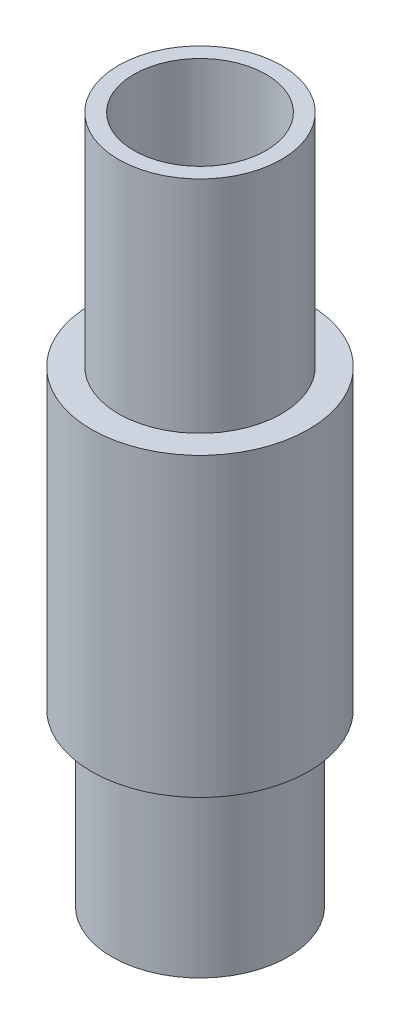
ISO-10303-21;
HEADER;
FILE_DESCRIPTION(('STEP AP214'),'2;1');
FILE_NAME('part.step','',(''),(''),'','','');
FILE_SCHEMA(('AUTOMOTIVE_DESIGN { 1 0 10303 214 1 1 1 1 }'));
ENDSEC;
DATA;
#1=APPLICATION_CONTEXT('core data for automotive mechanical design processes');
#2=APPLICATION_PROTOCOL_DEFINITION('international standard','automotive_design',2000,#1);
#3=PRODUCT_CONTEXT('',#1,'mechanical');
#4=PRODUCT('Part','Part','',(#3));
#5=PRODUCT_RELATED_PRODUCT_CATEGORY('part','',(#4));
#6=PRODUCT_DEFINITION_FORMATION('','',#4);
#7=PRODUCT_DEFINITION_CONTEXT('part definition',#1,'design');
#8=PRODUCT_DEFINITION('design','',#6,#7);
#9=PRODUCT_DEFINITION_SHAPE('','',#8);
#10=(LENGTH_UNIT() NAMED_UNIT(*) SI_UNIT(.MILLI.,.METRE.));
#11=(NAMED_UNIT(*) PLANE_ANGLE_UNIT() SI_UNIT($,.RADIAN.));
#12=(NAMED_UNIT(*) SI_UNIT($,.STERADIAN.) SOLID_ANGLE_UNIT());
#13=UNCERTAINTY_MEASURE_WITH_UNIT(LENGTH_MEASURE(1.E-05),#10,'distance_accuracy_value','');
#14=(GEOMETRIC_REPRESENTATION_CONTEXT(3) GLOBAL_UNCERTAINTY_ASSIGNED_CONTEXT((#13)) GLOBAL_UNIT_ASSIGNED_CONTEXT((#10,
#11,#12)) REPRESENTATION_CONTEXT('',''));
#15=CARTESIAN_POINT('',(0.,0.,0.));
#16=DIRECTION('',(0.,0.,1.));
#17=DIRECTION('',(1.,0.,0.));
#18=AXIS2_PLACEMENT_3D('',#15,#16,#17);
#19=CARTESIAN_POINT('',(0.,10.,0.));
#20=DIRECTION('',(0.,1.,0.));
#21=DIRECTION('',(0.,0.,1.));
#22=AXIS2_PLACEMENT_3D('',#19,#20,#21);
#23=CONICAL_SURFACE('',#22,5.85,0.00499995833395829);
#24=CARTESIAN_POINT('',(0.,0.,0.));
#25=DIRECTION('',(0.,-1.,0.));
#26=DIRECTION('',(0.,0.,-1.));
#27=AXIS2_PLACEMENT_3D('',#24,#25,#26);
#28=CIRCLE('',#27,5.8);
#29=CARTESIAN_POINT('',(0.,0.,-5.8));
#30=VERTEX_POINT('',#29);
#31=EDGE_CURVE('E10',#30,#30,#28,.T.);
#32=ORIENTED_EDGE('',*,*,#31,.T.);
#33=EDGE_LOOP('',(#32));
#34=FACE_BOUND('',#33,.T.);
#35=CARTESIAN_POINT('',(0.,10.,0.));
#36=DIRECTION('',(0.,-1.,0.));
#37=DIRECTION('',(0.,0.,-1.));
#38=AXIS2_PLACEMENT_3D('',#35,#36,#37);
#39=CIRCLE('',#38,5.85);
#40=CARTESIAN_POINT('',(0.,10.,-5.85));
#41=VERTEX_POINT('',#40);
#42=EDGE_CURVE('E71',#41,#41,#39,.T.);
#43=ORIENTED_EDGE('',*,*,#42,.F.);
#44=EDGE_LOOP('',(#43));
#45=FACE_BOUND('',#44,.T.);
#46=ADVANCED_FACE('F31',(#34,#45),#23,.F.);
#47=CARTESIAN_POINT('',(5.8,0.,0.));
#48=DIRECTION('',(0.,-1.,0.));
#49=DIRECTION('',(0.,0.,-1.));
#50=AXIS2_PLACEMENT_3D('',#47,#48,#49);
#51=PLANE('',#50);
#52=CARTESIAN_POINT('',(0.,0.,0.));
#53=DIRECTION('',(0.,-1.,0.));
#54=DIRECTION('',(0.,0.,-1.));
#55=AXIS2_PLACEMENT_3D('',#52,#53,#54);
#56=CIRCLE('',#55,8.);
#57=CARTESIAN_POINT('',(0.,0.,-8.));
#58=VERTEX_POINT('',#57);
#59=EDGE_CURVE('E37',#58,#58,#56,.T.);
#60=ORIENTED_EDGE('',*,*,#59,.T.);
#61=EDGE_LOOP('',(#60));
#62=FACE_BOUND('',#61,.T.);
#63=ORIENTED_EDGE('',*,*,#31,.F.);
#64=EDGE_LOOP('',(#63));
#65=FACE_BOUND('',#64,.T.);
#66=ADVANCED_FACE('F79',(#62,#65),#51,.T.);
#67=CARTESIAN_POINT('',(0.,0.,0.));
#68=DIRECTION('',(0.,-1.,0.));
#69=DIRECTION('',(0.,0.,-1.));
#70=AXIS2_PLACEMENT_3D('',#67,#68,#69);
#71=CYLINDRICAL_SURFACE('',#70,8.);
#72=CARTESIAN_POINT('',(0.,15.5,0.));
#73=DIRECTION('',(0.,-1.,0.));
#74=DIRECTION('',(0.,0.,-1.));
#75=AXIS2_PLACEMENT_3D('',#72,#73,#74);
#76=CIRCLE('',#75,8.);
#77=CARTESIAN_POINT('',(0.,15.5,-8.));
#78=VERTEX_POINT('',#77);
#79=EDGE_CURVE('E41',#78,#78,#76,.T.);
#80=ORIENTED_EDGE('',*,*,#79,.T.);
#81=EDGE_LOOP('',(#80));
#82=FACE_BOUND('',#81,.T.);
#83=ORIENTED_EDGE('',*,*,#59,.F.);
#84=EDGE_LOOP('',(#83));
#85=FACE_BOUND('',#84,.T.);
#86=ADVANCED_FACE('F83',(#82,#85),#71,.T.);
#87=CARTESIAN_POINT('',(8.,15.5,0.));
#88=DIRECTION('',(0.,-1.,0.));
#89=DIRECTION('',(0.,0.,-1.));
#90=AXIS2_PLACEMENT_3D('',#87,#88,#89);
#91=PLANE('',#90);
#92=CARTESIAN_POINT('',(0.,15.5,0.));
#93=DIRECTION('',(0.,-1.,0.));
#94=DIRECTION('',(0.,0.,-1.));
#95=AXIS2_PLACEMENT_3D('',#92,#93,#94);
#96=CIRCLE('',#95,9.85);
#97=CARTESIAN_POINT('',(0.,15.5,-9.85));
#98=VERTEX_POINT('',#97);
#99=EDGE_CURVE('E45',#98,#98,#96,.T.);
#100=ORIENTED_EDGE('',*,*,#99,.T.);
#101=EDGE_LOOP('',(#100));
#102=FACE_BOUND('',#101,.T.);
#103=ORIENTED_EDGE('',*,*,#79,.F.);
#104=EDGE_LOOP('',(#103));
#105=FACE_BOUND('',#104,.T.);
#106=ADVANCED_FACE('F87',(#102,#105),#91,.T.);
#107=CARTESIAN_POINT('',(0.,0.,0.));
#108=DIRECTION('',(0.,-1.,0.));
#109=DIRECTION('',(0.,0.,-1.));
#110=AXIS2_PLACEMENT_3D('',#107,#108,#109);
#111=CYLINDRICAL_SURFACE('',#110,9.85);
#112=CARTESIAN_POINT('',(0.,42.4,0.));
#113=DIRECTION('',(0.,-1.,0.));
#114=DIRECTION('',(0.,0.,-1.));
#115=AXIS2_PLACEMENT_3D('',#112,#113,#114);
#116=CIRCLE('',#115,9.85);
#117=CARTESIAN_POINT('',(0.,42.4,-9.85));
#118=VERTEX_POINT('',#117);
#119=EDGE_CURVE('E50',#118,#118,#116,.T.);
#120=ORIENTED_EDGE('',*,*,#119,.T.);
#121=EDGE_LOOP('',(#120));
#122=FACE_BOUND('',#121,.T.);
#123=ORIENTED_EDGE('',*,*,#99,.F.);
#124=EDGE_LOOP('',(#123));
#125=FACE_BOUND('',#124,.T.);
#126=ADVANCED_FACE('F94',(#122,#125),#111,.T.);
#127=CARTESIAN_POINT('',(9.85,42.4,0.));
#128=DIRECTION('',(0.,1.,0.));
#129=DIRECTION('',(0.,0.,1.));
#130=AXIS2_PLACEMENT_3D('',#127,#128,#129);
#131=PLANE('',#130);
#132=CARTESIAN_POINT('',(0.,42.4,0.));
#133=DIRECTION('',(0.,-1.,0.));
#134=DIRECTION('',(0.,0.,-1.));
#135=AXIS2_PLACEMENT_3D('',#132,#133,#134);
#136=CIRCLE('',#135,7.4);
#137=CARTESIAN_POINT('',(0.,42.4,-7.4));
#138=VERTEX_POINT('',#137);
#139=EDGE_CURVE('E53',#138,#138,#136,.T.);
#140=ORIENTED_EDGE('',*,*,#139,.T.);
#141=EDGE_LOOP('',(#140));
#142=FACE_BOUND('',#141,.T.);
#143=ORIENTED_EDGE('',*,*,#119,.F.);
#144=EDGE_LOOP('',(#143));
#145=FACE_BOUND('',#144,.T.);
#146=ADVANCED_FACE('F98',(#142,#145),#131,.T.);
#147=CARTESIAN_POINT('',(0.,0.,0.));
#148=DIRECTION('',(0.,-1.,0.));
#149=DIRECTION('',(0.,0.,-1.));
#150=AXIS2_PLACEMENT_3D('',#147,#148,#149);
#151=CYLINDRICAL_SURFACE('',#150,7.4);
#152=CARTESIAN_POINT('',(0.,62.4,0.));
#153=DIRECTION('',(0.,-1.,0.));
#154=DIRECTION('',(0.,0.,-1.));
#155=AXIS2_PLACEMENT_3D('',#152,#153,#154);
#156=CIRCLE('',#155,7.4);
#157=CARTESIAN_POINT('',(0.,62.4,-7.4));
#158=VERTEX_POINT('',#157);
#159=EDGE_CURVE('E56',#158,#158,#156,.T.);
#160=ORIENTED_EDGE('',*,*,#159,.T.);
#161=EDGE_LOOP('',(#160));
#162=FACE_BOUND('',#161,.T.);
#163=ORIENTED_EDGE('',*,*,#139,.F.);
#164=EDGE_LOOP('',(#163));
#165=FACE_BOUND('',#164,.T.);
#166=ADVANCED_FACE('F102',(#162,#165),#151,.T.);
#167=CARTESIAN_POINT('',(6.,62.4,0.));
#168=DIRECTION('',(0.,1.,0.));
#169=DIRECTION('',(0.,0.,1.));
#170=AXIS2_PLACEMENT_3D('',#167,#168,#169);
#171=PLANE('',#170);
#172=CARTESIAN_POINT('',(0.,62.4,0.));
#173=DIRECTION('',(0.,-1.,0.));
#174=DIRECTION('',(0.,0.,-1.));
#175=AXIS2_PLACEMENT_3D('',#172,#173,#174);
#176=CIRCLE('',#175,6.);
#177=CARTESIAN_POINT('',(0.,62.4,-6.));
#178=VERTEX_POINT('',#177);
#179=EDGE_CURVE('E59',#178,#178,#176,.T.);
#180=ORIENTED_EDGE('',*,*,#179,.T.);
#181=EDGE_LOOP('',(#180));
#182=FACE_BOUND('',#181,.T.);
#183=ORIENTED_EDGE('',*,*,#159,.F.);
#184=EDGE_LOOP('',(#183));
#185=FACE_BOUND('',#184,.T.);
#186=ADVANCED_FACE('F106',(#182,#185),#171,.T.);
#187=CARTESIAN_POINT('',(0.,0.,0.));
#188=DIRECTION('',(0.,-1.,0.));
#189=DIRECTION('',(0.,0.,-1.));
#190=AXIS2_PLACEMENT_3D('',#187,#188,#189);
#191=CYLINDRICAL_SURFACE('',#190,6.);
#192=CARTESIAN_POINT('',(0.,11.95,0.));
#193=DIRECTION('',(0.,-1.,0.));
#194=DIRECTION('',(0.,0.,-1.));
#195=AXIS2_PLACEMENT_3D('',#192,#193,#194);
#196=CIRCLE('',#195,6.);
#197=CARTESIAN_POINT('',(0.,11.95,-6.));
#198=VERTEX_POINT('',#197);
#199=EDGE_CURVE('E62',#198,#198,#196,.T.);
#200=ORIENTED_EDGE('',*,*,#199,.T.);
#201=EDGE_LOOP('',(#200));
#202=FACE_BOUND('',#201,.T.);
#203=ORIENTED_EDGE('',*,*,#179,.F.);
#204=EDGE_LOOP('',(#203));
#205=FACE_BOUND('',#204,.T.);
#206=ADVANCED_FACE('F110',(#202,#205),#191,.F.);
#207=CARTESIAN_POINT('',(0.,11.95,0.));
#208=DIRECTION('',(0.,1.,0.));
#209=DIRECTION('',(0.,0.,1.));
#210=AXIS2_PLACEMENT_3D('',#207,#208,#209);
#211=CONICAL_SURFACE('',#210,6.,0.785398163397449);
#212=CARTESIAN_POINT('',(0.,11.,0.));
#213=DIRECTION('',(0.,-1.,0.));
#214=DIRECTION('',(0.,0.,-1.));
#215=AXIS2_PLACEMENT_3D('',#212,#213,#214);
#216=CIRCLE('',#215,5.05);
#217=CARTESIAN_POINT('',(0.,11.,-5.05));
#218=VERTEX_POINT('',#217);
#219=EDGE_CURVE('E65',#218,#218,#216,.T.);
#220=ORIENTED_EDGE('',*,*,#219,.T.);
#221=EDGE_LOOP('',(#220));
#222=FACE_BOUND('',#221,.T.);
#223=ORIENTED_EDGE('',*,*,#199,.F.);
#224=EDGE_LOOP('',(#223));
#225=FACE_BOUND('',#224,.T.);
#226=ADVANCED_FACE('F114',(#222,#225),#211,.F.);
#227=CARTESIAN_POINT('',(0.,0.,0.));
#228=DIRECTION('',(0.,-1.,0.));
#229=DIRECTION('',(0.,0.,-1.));
#230=AXIS2_PLACEMENT_3D('',#227,#228,#229);
#231=CYLINDRICAL_SURFACE('',#230,5.05);
#232=CARTESIAN_POINT('',(0.,10.,0.));
#233=DIRECTION('',(0.,-1.,0.));
#234=DIRECTION('',(0.,0.,-1.));
#235=AXIS2_PLACEMENT_3D('',#232,#233,#234);
#236=CIRCLE('',#235,5.05);
#237=CARTESIAN_POINT('',(0.,10.,-5.05));
#238=VERTEX_POINT('',#237);
#239=EDGE_CURVE('E68',#238,#238,#236,.T.);
#240=ORIENTED_EDGE('',*,*,#239,.T.);
#241=EDGE_LOOP('',(#240));
#242=FACE_BOUND('',#241,.T.);
#243=ORIENTED_EDGE('',*,*,#219,.F.);
#244=EDGE_LOOP('',(#243));
#245=FACE_BOUND('',#244,.T.);
#246=ADVANCED_FACE('F118',(#242,#245),#231,.F.);
#247=CARTESIAN_POINT('',(5.05,10.,0.));
#248=DIRECTION('',(0.,-1.,0.));
#249=DIRECTION('',(0.,0.,-1.));
#250=AXIS2_PLACEMENT_3D('',#247,#248,#249);
#251=PLANE('',#250);
#252=ORIENTED_EDGE('',*,*,#42,.T.);
#253=EDGE_LOOP('',(#252));
#254=FACE_BOUND('',#253,.T.);
#255=ORIENTED_EDGE('',*,*,#239,.F.);
#256=EDGE_LOOP('',(#255));
#257=FACE_BOUND('',#256,.T.);
#258=ADVANCED_FACE('F75',(#254,#257),#251,.T.);
#259=CLOSED_SHELL('',(#46,#66,#86,#106,#126,#146,#166,#186,#206,#226,#246,#258));
#260=MANIFOLD_SOLID_BREP('B2',#259);
#261=ADVANCED_BREP_SHAPE_REPRESENTATION('',(#18,#260),#14);
#262=SHAPE_DEFINITION_REPRESENTATION(#9,#261);
ENDSEC;
END-ISO-10303-21;
